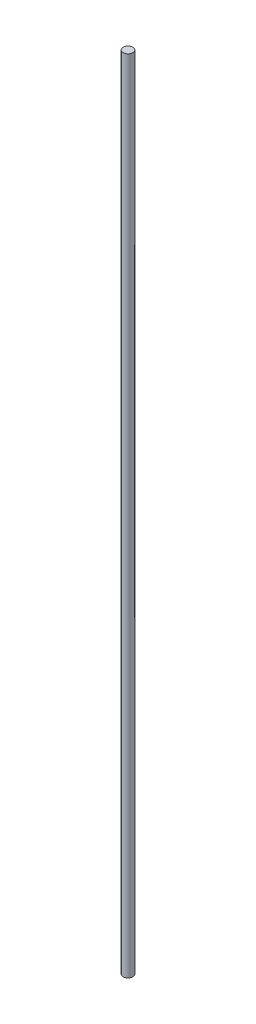
ISO-10303-21;
HEADER;
FILE_DESCRIPTION(('STEP AP214'),'2;1');
FILE_NAME('part.step','',(''),(''),'','','');
FILE_SCHEMA(('AUTOMOTIVE_DESIGN { 1 0 10303 214 1 1 1 1 }'));
ENDSEC;
DATA;
#1=APPLICATION_CONTEXT('core data for automotive mechanical design processes');
#2=APPLICATION_PROTOCOL_DEFINITION('international standard','automotive_design',2000,#1);
#3=PRODUCT_CONTEXT('',#1,'mechanical');
#4=PRODUCT('Part','Part','',(#3));
#5=PRODUCT_RELATED_PRODUCT_CATEGORY('part','',(#4));
#6=PRODUCT_DEFINITION_FORMATION('','',#4);
#7=PRODUCT_DEFINITION_CONTEXT('part definition',#1,'design');
#8=PRODUCT_DEFINITION('design','',#6,#7);
#9=PRODUCT_DEFINITION_SHAPE('','',#8);
#10=(LENGTH_UNIT() NAMED_UNIT(*) SI_UNIT(.MILLI.,.METRE.));
#11=(NAMED_UNIT(*) PLANE_ANGLE_UNIT() SI_UNIT($,.RADIAN.));
#12=(NAMED_UNIT(*) SI_UNIT($,.STERADIAN.) SOLID_ANGLE_UNIT());
#13=UNCERTAINTY_MEASURE_WITH_UNIT(LENGTH_MEASURE(1.E-05),#10,'distance_accuracy_value','');
#14=(GEOMETRIC_REPRESENTATION_CONTEXT(3) GLOBAL_UNCERTAINTY_ASSIGNED_CONTEXT((#13)) GLOBAL_UNIT_ASSIGNED_CONTEXT((#10,
#11,#12)) REPRESENTATION_CONTEXT('',''));
#15=CARTESIAN_POINT('',(0.,0.,0.));
#16=DIRECTION('',(0.,0.,1.));
#17=DIRECTION('',(1.,0.,0.));
#18=AXIS2_PLACEMENT_3D('',#15,#16,#17);
#19=CARTESIAN_POINT('',(0.,-36.,0.));
#20=DIRECTION('',(0.,1.,0.));
#21=DIRECTION('',(0.,0.,1.));
#22=AXIS2_PLACEMENT_3D('',#19,#20,#21);
#23=PLANE('',#22);
#24=CARTESIAN_POINT('',(0.,-36.,0.));
#25=DIRECTION('',(0.,-1.,0.));
#26=DIRECTION('',(0.,0.,-1.));
#27=AXIS2_PLACEMENT_3D('',#24,#25,#26);
#28=CIRCLE('',#27,0.75);
#29=CARTESIAN_POINT('',(0.,-36.,-0.75));
#30=VERTEX_POINT('',#29);
#31=EDGE_CURVE('E10',#30,#30,#28,.T.);
#32=ORIENTED_EDGE('',*,*,#31,.F.);
#33=EDGE_LOOP('',(#32));
#34=FACE_BOUND('',#33,.T.);
#35=ADVANCED_FACE('F31',(#34),#23,.T.);
#36=CARTESIAN_POINT('',(0.,-165.,0.));
#37=DIRECTION('',(0.,-1.,0.));
#38=DIRECTION('',(0.,0.,-1.));
#39=AXIS2_PLACEMENT_3D('',#36,#37,#38);
#40=CYLINDRICAL_SURFACE('',#39,0.75);
#41=ORIENTED_EDGE('',*,*,#31,.T.);
#42=EDGE_LOOP('',(#41));
#43=FACE_BOUND('',#42,.T.);
#44=CARTESIAN_POINT('',(0.,-161.,0.));
#45=DIRECTION('',(0.,-1.,0.));
#46=DIRECTION('',(0.,0.,-1.));
#47=AXIS2_PLACEMENT_3D('',#44,#45,#46);
#48=CIRCLE('',#47,0.75);
#49=CARTESIAN_POINT('',(0.,-161.,-0.75));
#50=VERTEX_POINT('',#49);
#51=EDGE_CURVE('E37',#50,#50,#48,.T.);
#52=ORIENTED_EDGE('',*,*,#51,.F.);
#53=EDGE_LOOP('',(#52));
#54=FACE_BOUND('',#53,.T.);
#55=ADVANCED_FACE('F45',(#43,#54),#40,.T.);
#56=CARTESIAN_POINT('',(0.75,-161.,0.));
#57=DIRECTION('',(0.,-1.,0.));
#58=DIRECTION('',(0.,0.,-1.));
#59=AXIS2_PLACEMENT_3D('',#56,#57,#58);
#60=PLANE('',#59);
#61=ORIENTED_EDGE('',*,*,#51,.T.);
#62=EDGE_LOOP('',(#61));
#63=FACE_BOUND('',#62,.T.);
#64=ADVANCED_FACE('F43',(#63),#60,.T.);
#65=CLOSED_SHELL('',(#35,#55,#64));
#66=MANIFOLD_SOLID_BREP('B2',#65);
#67=ADVANCED_BREP_SHAPE_REPRESENTATION('',(#18,#66),#14);
#68=SHAPE_DEFINITION_REPRESENTATION(#9,#67);
ENDSEC;
END-ISO-10303-21;
